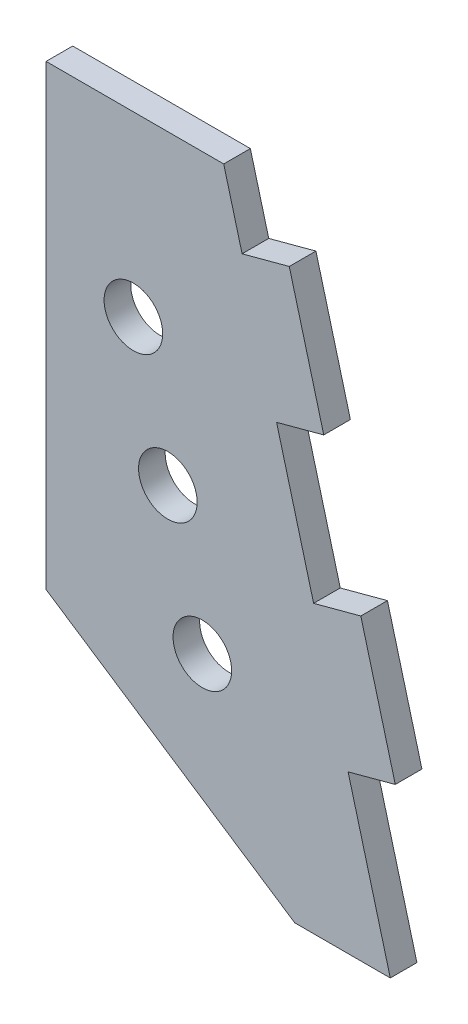
ISO-10303-21;
HEADER;
FILE_DESCRIPTION(('STEP AP214'),'2;1');
FILE_NAME('part.step','',(''),(''),'','','');
FILE_SCHEMA(('AUTOMOTIVE_DESIGN { 1 0 10303 214 1 1 1 1 }'));
ENDSEC;
DATA;
#1=APPLICATION_CONTEXT('core data for automotive mechanical design processes');
#2=APPLICATION_PROTOCOL_DEFINITION('international standard','automotive_design',2000,#1);
#3=PRODUCT_CONTEXT('',#1,'mechanical');
#4=PRODUCT('Part','Part','',(#3));
#5=PRODUCT_RELATED_PRODUCT_CATEGORY('part','',(#4));
#6=PRODUCT_DEFINITION_FORMATION('','',#4);
#7=PRODUCT_DEFINITION_CONTEXT('part definition',#1,'design');
#8=PRODUCT_DEFINITION('design','',#6,#7);
#9=PRODUCT_DEFINITION_SHAPE('','',#8);
#10=(LENGTH_UNIT() NAMED_UNIT(*) SI_UNIT(.MILLI.,.METRE.));
#11=(NAMED_UNIT(*) PLANE_ANGLE_UNIT() SI_UNIT($,.RADIAN.));
#12=(NAMED_UNIT(*) SI_UNIT($,.STERADIAN.) SOLID_ANGLE_UNIT());
#13=UNCERTAINTY_MEASURE_WITH_UNIT(LENGTH_MEASURE(1.E-05),#10,'distance_accuracy_value','');
#14=(GEOMETRIC_REPRESENTATION_CONTEXT(3) GLOBAL_UNCERTAINTY_ASSIGNED_CONTEXT((#13)) GLOBAL_UNIT_ASSIGNED_CONTEXT((#10,
#11,#12)) REPRESENTATION_CONTEXT('',''));
#15=CARTESIAN_POINT('',(0.,0.,0.));
#16=DIRECTION('',(0.,0.,1.));
#17=DIRECTION('',(1.,0.,0.));
#18=AXIS2_PLACEMENT_3D('',#15,#16,#17);
#19=CARTESIAN_POINT('',(0.,0.,0.));
#20=DIRECTION('',(0.,0.,-1.));
#21=DIRECTION('',(-1.,0.,0.));
#22=AXIS2_PLACEMENT_3D('',#19,#20,#21);
#23=PLANE('',#22);
#24=CARTESIAN_POINT('',(9.82984114247129,40.,0.));
#25=DIRECTION('',(0.,0.,1.));
#26=DIRECTION('',(1.,0.,0.));
#27=AXIS2_PLACEMENT_3D('',#24,#25,#26);
#28=CIRCLE('',#27,3.3);
#29=CARTESIAN_POINT('',(13.1298411424713,40.,0.));
#30=VERTEX_POINT('',#29);
#31=EDGE_CURVE('E270',#30,#30,#28,.T.);
#32=ORIENTED_EDGE('',*,*,#31,.T.);
#33=EDGE_LOOP('',(#32));
#34=FACE_BOUND('',#33,.T.);
#35=CARTESIAN_POINT('',(17.594412495547,11.022225211328,0.));
#36=DIRECTION('',(0.,0.,1.));
#37=DIRECTION('',(1.,0.,0.));
#38=AXIS2_PLACEMENT_3D('',#35,#36,#37);
#39=CIRCLE('',#38,3.3);
#40=CARTESIAN_POINT('',(20.894412495547,11.022225211328,0.));
#41=VERTEX_POINT('',#40);
#42=EDGE_CURVE('E203',#41,#41,#39,.T.);
#43=ORIENTED_EDGE('',*,*,#42,.T.);
#44=EDGE_LOOP('',(#43));
#45=FACE_BOUND('',#44,.T.);
#46=CARTESIAN_POINT('',(13.7121268190092,25.511112605664,0.));
#47=DIRECTION('',(0.,0.,1.));
#48=DIRECTION('',(1.,0.,0.));
#49=AXIS2_PLACEMENT_3D('',#46,#47,#48);
#50=CIRCLE('',#49,3.3);
#51=CARTESIAN_POINT('',(17.0121268190092,25.511112605664,0.));
#52=VERTEX_POINT('',#51);
#53=EDGE_CURVE('E221',#52,#52,#50,.T.);
#54=ORIENTED_EDGE('',*,*,#53,.T.);
#55=EDGE_LOOP('',(#54));
#56=FACE_BOUND('',#55,.T.);
#57=DIRECTION('',(1.,0.,0.));
#58=VECTOR('',#57,1.);
#59=CARTESIAN_POINT('',(0.,-10.,0.));
#60=LINE('',#59,#58);
#61=CARTESIAN_POINT('',(28.,-10.,0.));
#62=VERTEX_POINT('',#61);
#63=CARTESIAN_POINT('',(38.7564434701789,-10.,0.));
#64=VERTEX_POINT('',#63);
#65=EDGE_CURVE('E158',#62,#64,#60,.T.);
#66=ORIENTED_EDGE('',*,*,#65,.F.);
#67=DIRECTION('',(0.834335320661301,-0.551257265436931,0.));
#68=VECTOR('',#67,1.);
#69=CARTESIAN_POINT('',(3.90943396226415,5.91698113207547,0.));
#70=LINE('',#69,#68);
#71=CARTESIAN_POINT('',(0.,8.5,0.));
#72=VERTEX_POINT('',#71);
#73=EDGE_CURVE('E62',#72,#62,#70,.T.);
#74=ORIENTED_EDGE('',*,*,#73,.F.);
#75=DIRECTION('',(0.,-1.,0.));
#76=VECTOR('',#75,1.);
#77=CARTESIAN_POINT('',(0.,0.,0.));
#78=LINE('',#77,#76);
#79=CARTESIAN_POINT('',(0.,60.,0.));
#80=VERTEX_POINT('',#79);
#81=EDGE_CURVE('E156',#80,#72,#78,.T.);
#82=ORIENTED_EDGE('',*,*,#81,.F.);
#83=DIRECTION('',(-1.,0.,0.));
#84=VECTOR('',#83,1.);
#85=CARTESIAN_POINT('',(0.,60.,0.));
#86=LINE('',#85,#84);
#87=CARTESIAN_POINT('',(20.,60.,0.));
#88=VERTEX_POINT('',#87);
#89=EDGE_CURVE('E166',#88,#80,#86,.T.);
#90=ORIENTED_EDGE('',*,*,#89,.F.);
#91=DIRECTION('',(-0.258819045102525,0.965925826289067,0.));
#92=VECTOR('',#91,1.);
#93=CARTESIAN_POINT('',(20.,60.,0.));
#94=LINE('',#93,#92);
#95=CARTESIAN_POINT('',(22.0705523608202,52.2725933896875,0.));
#96=VERTEX_POINT('',#95);
#97=EDGE_CURVE('E195',#96,#88,#94,.T.);
#98=ORIENTED_EDGE('',*,*,#97,.F.);
#99=DIRECTION('',(-0.965925826289067,-0.258819045102525,0.));
#100=VECTOR('',#99,1.);
#101=CARTESIAN_POINT('',(22.0705523608202,52.2725933896875,0.));
#102=LINE('',#101,#100);
#103=CARTESIAN_POINT('',(27.3831444054101,53.6960981377513,0.));
#104=VERTEX_POINT('',#103);
#105=EDGE_CURVE('E256',#104,#96,#102,.T.);
#106=ORIENTED_EDGE('',*,*,#105,.F.);
#107=DIRECTION('',(-0.258819045102525,0.965925826289067,0.));
#108=VECTOR('',#107,1.);
#109=CARTESIAN_POINT('',(27.3831444054101,53.6960981377513,0.));
#110=LINE('',#109,#108);
#111=CARTESIAN_POINT('',(31.265430081948,39.2072107434153,0.));
#112=VERTEX_POINT('',#111);
#113=EDGE_CURVE('E262',#112,#104,#110,.T.);
#114=ORIENTED_EDGE('',*,*,#113,.F.);
#115=DIRECTION('',(0.965925826289067,0.258819045102525,0.));
#116=VECTOR('',#115,1.);
#117=CARTESIAN_POINT('',(31.265430081948,39.2072107434153,0.));
#118=LINE('',#117,#116);
#119=CARTESIAN_POINT('',(25.9528380373581,37.7837059953515,0.));
#120=VERTEX_POINT('',#119);
#121=EDGE_CURVE('E342',#120,#112,#118,.T.);
#122=ORIENTED_EDGE('',*,*,#121,.F.);
#123=CARTESIAN_POINT('',(30.1241135085096,22.2162940046486,0.));
#124=VERTEX_POINT('',#123);
#125=EDGE_CURVE('E194',#124,#120,#94,.T.);
#126=ORIENTED_EDGE('',*,*,#125,.F.);
#127=DIRECTION('',(-0.965925826289067,-0.258819045102524,0.));
#128=VECTOR('',#127,1.);
#129=CARTESIAN_POINT('',(30.1241135085096,22.2162940046486,0.));
#130=LINE('',#129,#128);
#131=CARTESIAN_POINT('',(35.4367055530994,23.6397987527124,0.));
#132=VERTEX_POINT('',#131);
#133=EDGE_CURVE('E350',#132,#124,#130,.T.);
#134=ORIENTED_EDGE('',*,*,#133,.F.);
#135=DIRECTION('',(-0.258819045102524,0.965925826289067,0.));
#136=VECTOR('',#135,1.);
#137=CARTESIAN_POINT('',(35.4367055530994,23.6397987527124,0.));
#138=LINE('',#137,#136);
#139=CARTESIAN_POINT('',(39.3189912296373,9.15091135837642,0.));
#140=VERTEX_POINT('',#139);
#141=EDGE_CURVE('E368',#140,#132,#138,.T.);
#142=ORIENTED_EDGE('',*,*,#141,.F.);
#143=DIRECTION('',(0.965925826289067,0.258819045102525,0.));
#144=VECTOR('',#143,1.);
#145=CARTESIAN_POINT('',(39.3189912296373,9.15091135837642,0.));
#146=LINE('',#145,#144);
#147=CARTESIAN_POINT('',(34.0063991850474,7.72740661031254,0.));
#148=VERTEX_POINT('',#147);
#149=EDGE_CURVE('E358',#148,#140,#146,.T.);
#150=ORIENTED_EDGE('',*,*,#149,.F.);
#151=EDGE_CURVE('E176',#64,#148,#94,.T.);
#152=ORIENTED_EDGE('',*,*,#151,.F.);
#153=EDGE_LOOP('',(#66,#74,#82,#90,#98,#106,#114,#122,#126,#134,#142,#150,#152));
#154=FACE_BOUND('',#153,.T.);
#155=ADVANCED_FACE('F46',(#34,#45,#56,#154),#23,.T.);
#156=CARTESIAN_POINT('',(0.,0.,3.));
#157=DIRECTION('',(1.,0.,0.));
#158=DIRECTION('',(0.,0.,-1.));
#159=AXIS2_PLACEMENT_3D('',#156,#157,#158);
#160=PLANE('',#159);
#161=DIRECTION('',(0.,0.,1.));
#162=VECTOR('',#161,1.);
#163=CARTESIAN_POINT('',(0.,8.5,0.));
#164=LINE('',#163,#162);
#165=CARTESIAN_POINT('',(0.,8.5,3.));
#166=VERTEX_POINT('',#165);
#167=EDGE_CURVE('E141',#72,#166,#164,.T.);
#168=ORIENTED_EDGE('',*,*,#167,.T.);
#169=DIRECTION('',(0.,-1.,0.));
#170=VECTOR('',#169,1.);
#171=CARTESIAN_POINT('',(0.,0.,3.));
#172=LINE('',#171,#170);
#173=CARTESIAN_POINT('',(0.,60.,3.));
#174=VERTEX_POINT('',#173);
#175=EDGE_CURVE('E180',#174,#166,#172,.T.);
#176=ORIENTED_EDGE('',*,*,#175,.F.);
#177=DIRECTION('',(0.,0.,-1.));
#178=VECTOR('',#177,1.);
#179=CARTESIAN_POINT('',(0.,60.,3.));
#180=LINE('',#179,#178);
#181=EDGE_CURVE('E55',#174,#80,#180,.T.);
#182=ORIENTED_EDGE('',*,*,#181,.T.);
#183=ORIENTED_EDGE('',*,*,#81,.T.);
#184=EDGE_LOOP('',(#168,#176,#182,#183));
#185=FACE_BOUND('',#184,.T.);
#186=ADVANCED_FACE('F162',(#185),#160,.F.);
#187=CARTESIAN_POINT('',(0.,0.,3.));
#188=DIRECTION('',(0.,0.,-1.));
#189=DIRECTION('',(-1.,0.,0.));
#190=AXIS2_PLACEMENT_3D('',#187,#188,#189);
#191=PLANE('',#190);
#192=CARTESIAN_POINT('',(17.594412495547,11.022225211328,3.));
#193=DIRECTION('',(0.,0.,1.));
#194=DIRECTION('',(1.,0.,0.));
#195=AXIS2_PLACEMENT_3D('',#192,#193,#194);
#196=CIRCLE('',#195,3.29999999999999);
#197=CARTESIAN_POINT('',(20.894412495547,11.022225211328,3.));
#198=VERTEX_POINT('',#197);
#199=EDGE_CURVE('E213',#198,#198,#196,.T.);
#200=ORIENTED_EDGE('',*,*,#199,.F.);
#201=EDGE_LOOP('',(#200));
#202=FACE_BOUND('',#201,.T.);
#203=CARTESIAN_POINT('',(13.7121268190092,25.511112605664,3.));
#204=DIRECTION('',(0.,0.,1.));
#205=DIRECTION('',(1.,0.,0.));
#206=AXIS2_PLACEMENT_3D('',#203,#204,#205);
#207=CIRCLE('',#206,3.29999999999999);
#208=CARTESIAN_POINT('',(17.0121268190092,25.511112605664,3.));
#209=VERTEX_POINT('',#208);
#210=EDGE_CURVE('E274',#209,#209,#207,.T.);
#211=ORIENTED_EDGE('',*,*,#210,.F.);
#212=EDGE_LOOP('',(#211));
#213=FACE_BOUND('',#212,.T.);
#214=CARTESIAN_POINT('',(9.82984114247129,40.,3.));
#215=DIRECTION('',(0.,0.,1.));
#216=DIRECTION('',(1.,0.,0.));
#217=AXIS2_PLACEMENT_3D('',#214,#215,#216);
#218=CIRCLE('',#217,3.29999999999999);
#219=CARTESIAN_POINT('',(13.1298411424713,40.,3.));
#220=VERTEX_POINT('',#219);
#221=EDGE_CURVE('E266',#220,#220,#218,.T.);
#222=ORIENTED_EDGE('',*,*,#221,.F.);
#223=EDGE_LOOP('',(#222));
#224=FACE_BOUND('',#223,.T.);
#225=DIRECTION('',(0.834335320661301,-0.551257265436931,0.));
#226=VECTOR('',#225,1.);
#227=CARTESIAN_POINT('',(3.90943396226415,5.91698113207547,3.));
#228=LINE('',#227,#226);
#229=CARTESIAN_POINT('',(28.,-10.,3.));
#230=VERTEX_POINT('',#229);
#231=EDGE_CURVE('E144',#166,#230,#228,.T.);
#232=ORIENTED_EDGE('',*,*,#231,.T.);
#233=DIRECTION('',(1.,0.,0.));
#234=VECTOR('',#233,1.);
#235=CARTESIAN_POINT('',(0.,-10.,3.));
#236=LINE('',#235,#234);
#237=CARTESIAN_POINT('',(38.7564434701789,-10.,3.));
#238=VERTEX_POINT('',#237);
#239=EDGE_CURVE('E377',#230,#238,#236,.T.);
#240=ORIENTED_EDGE('',*,*,#239,.T.);
#241=DIRECTION('',(-0.258819045102525,0.965925826289067,0.));
#242=VECTOR('',#241,1.);
#243=CARTESIAN_POINT('',(20.,60.,3.));
#244=LINE('',#243,#242);
#245=CARTESIAN_POINT('',(34.0063991850474,7.72740661031254,3.));
#246=VERTEX_POINT('',#245);
#247=EDGE_CURVE('E174',#238,#246,#244,.T.);
#248=ORIENTED_EDGE('',*,*,#247,.T.);
#249=DIRECTION('',(0.965925826289067,0.258819045102525,0.));
#250=VECTOR('',#249,1.);
#251=CARTESIAN_POINT('',(39.3189912296373,9.15091135837642,3.));
#252=LINE('',#251,#250);
#253=CARTESIAN_POINT('',(39.3189912296373,9.15091135837642,3.));
#254=VERTEX_POINT('',#253);
#255=EDGE_CURVE('E362',#246,#254,#252,.T.);
#256=ORIENTED_EDGE('',*,*,#255,.T.);
#257=DIRECTION('',(-0.258819045102524,0.965925826289067,0.));
#258=VECTOR('',#257,1.);
#259=CARTESIAN_POINT('',(35.4367055530994,23.6397987527124,3.));
#260=LINE('',#259,#258);
#261=CARTESIAN_POINT('',(35.4367055530994,23.6397987527124,3.));
#262=VERTEX_POINT('',#261);
#263=EDGE_CURVE('E359',#254,#262,#260,.T.);
#264=ORIENTED_EDGE('',*,*,#263,.T.);
#265=DIRECTION('',(-0.965925826289067,-0.258819045102524,0.));
#266=VECTOR('',#265,1.);
#267=CARTESIAN_POINT('',(30.1241135085096,22.2162940046486,3.));
#268=LINE('',#267,#266);
#269=CARTESIAN_POINT('',(30.1241135085096,22.2162940046486,3.));
#270=VERTEX_POINT('',#269);
#271=EDGE_CURVE('E70',#262,#270,#268,.T.);
#272=ORIENTED_EDGE('',*,*,#271,.T.);
#273=CARTESIAN_POINT('',(25.9528380373581,37.7837059953514,3.));
#274=VERTEX_POINT('',#273);
#275=EDGE_CURVE('E172',#270,#274,#244,.T.);
#276=ORIENTED_EDGE('',*,*,#275,.T.);
#277=DIRECTION('',(0.965925826289067,0.258819045102525,0.));
#278=VECTOR('',#277,1.);
#279=CARTESIAN_POINT('',(31.265430081948,39.2072107434153,3.));
#280=LINE('',#279,#278);
#281=CARTESIAN_POINT('',(31.265430081948,39.2072107434153,3.));
#282=VERTEX_POINT('',#281);
#283=EDGE_CURVE('E238',#274,#282,#280,.T.);
#284=ORIENTED_EDGE('',*,*,#283,.T.);
#285=DIRECTION('',(-0.258819045102525,0.965925826289067,0.));
#286=VECTOR('',#285,1.);
#287=CARTESIAN_POINT('',(27.3831444054101,53.6960981377513,3.));
#288=LINE('',#287,#286);
#289=CARTESIAN_POINT('',(27.3831444054101,53.6960981377513,3.));
#290=VERTEX_POINT('',#289);
#291=EDGE_CURVE('E251',#282,#290,#288,.T.);
#292=ORIENTED_EDGE('',*,*,#291,.T.);
#293=DIRECTION('',(-0.965925826289067,-0.258819045102525,0.));
#294=VECTOR('',#293,1.);
#295=CARTESIAN_POINT('',(22.0705523608202,52.2725933896875,3.));
#296=LINE('',#295,#294);
#297=CARTESIAN_POINT('',(22.0705523608202,52.2725933896875,3.));
#298=VERTEX_POINT('',#297);
#299=EDGE_CURVE('E340',#290,#298,#296,.T.);
#300=ORIENTED_EDGE('',*,*,#299,.T.);
#301=CARTESIAN_POINT('',(20.,60.,3.));
#302=VERTEX_POINT('',#301);
#303=EDGE_CURVE('E165',#298,#302,#244,.T.);
#304=ORIENTED_EDGE('',*,*,#303,.T.);
#305=DIRECTION('',(-1.,0.,0.));
#306=VECTOR('',#305,1.);
#307=CARTESIAN_POINT('',(0.,60.,3.));
#308=LINE('',#307,#306);
#309=EDGE_CURVE('E185',#302,#174,#308,.T.);
#310=ORIENTED_EDGE('',*,*,#309,.T.);
#311=ORIENTED_EDGE('',*,*,#175,.T.);
#312=EDGE_LOOP('',(#232,#240,#248,#256,#264,#272,#276,#284,#292,#300,#304,#310,#311));
#313=FACE_BOUND('',#312,.T.);
#314=ADVANCED_FACE('F236',(#202,#213,#224,#313),#191,.F.);
#315=CARTESIAN_POINT('',(0.,-10.,0.));
#316=DIRECTION('',(0.,-1.,0.));
#317=DIRECTION('',(0.,0.,-1.));
#318=AXIS2_PLACEMENT_3D('',#315,#316,#317);
#319=PLANE('',#318);
#320=ORIENTED_EDGE('',*,*,#239,.F.);
#321=DIRECTION('',(0.,0.,1.));
#322=VECTOR('',#321,1.);
#323=CARTESIAN_POINT('',(28.,-10.,0.));
#324=LINE('',#323,#322);
#325=EDGE_CURVE('E150',#62,#230,#324,.T.);
#326=ORIENTED_EDGE('',*,*,#325,.F.);
#327=ORIENTED_EDGE('',*,*,#65,.T.);
#328=DIRECTION('',(0.,0.,1.));
#329=VECTOR('',#328,1.);
#330=CARTESIAN_POINT('',(38.7564434701789,-10.,0.));
#331=LINE('',#330,#329);
#332=EDGE_CURVE('E365',#64,#238,#331,.T.);
#333=ORIENTED_EDGE('',*,*,#332,.T.);
#334=EDGE_LOOP('',(#320,#326,#327,#333));
#335=FACE_BOUND('',#334,.T.);
#336=ADVANCED_FACE('F294',(#335),#319,.T.);
#337=CARTESIAN_POINT('',(20.,60.,3.));
#338=DIRECTION('',(-0.965925826289067,-0.258819045102525,0.));
#339=DIRECTION('',(0.258819045102525,-0.965925826289067,0.));
#340=AXIS2_PLACEMENT_3D('',#337,#338,#339);
#341=PLANE('',#340);
#342=ORIENTED_EDGE('',*,*,#275,.F.);
#343=DIRECTION('',(0.,0.,1.));
#344=VECTOR('',#343,1.);
#345=CARTESIAN_POINT('',(30.1241135085096,22.2162940046486,0.));
#346=LINE('',#345,#344);
#347=EDGE_CURVE('E252',#124,#270,#346,.T.);
#348=ORIENTED_EDGE('',*,*,#347,.F.);
#349=ORIENTED_EDGE('',*,*,#125,.T.);
#350=DIRECTION('',(0.,0.,1.));
#351=VECTOR('',#350,1.);
#352=CARTESIAN_POINT('',(25.9528380373581,37.7837059953515,0.));
#353=LINE('',#352,#351);
#354=EDGE_CURVE('E246',#120,#274,#353,.T.);
#355=ORIENTED_EDGE('',*,*,#354,.T.);
#356=EDGE_LOOP('',(#342,#348,#349,#355));
#357=FACE_BOUND('',#356,.T.);
#358=ADVANCED_FACE('F254',(#357),#341,.F.);
#359=DIRECTION('',(0.,0.,1.));
#360=VECTOR('',#359,1.);
#361=CARTESIAN_POINT('',(22.0705523608202,52.2725933896875,0.));
#362=LINE('',#361,#360);
#363=EDGE_CURVE('E271',#96,#298,#362,.T.);
#364=ORIENTED_EDGE('',*,*,#363,.F.);
#365=ORIENTED_EDGE('',*,*,#97,.T.);
#366=DIRECTION('',(0.,0.,-1.));
#367=VECTOR('',#366,1.);
#368=CARTESIAN_POINT('',(20.,60.,3.));
#369=LINE('',#368,#367);
#370=EDGE_CURVE('E11',#302,#88,#369,.T.);
#371=ORIENTED_EDGE('',*,*,#370,.F.);
#372=ORIENTED_EDGE('',*,*,#303,.F.);
#373=EDGE_LOOP('',(#364,#365,#371,#372));
#374=FACE_BOUND('',#373,.T.);
#375=ADVANCED_FACE('F327',(#374),#341,.F.);
#376=ORIENTED_EDGE('',*,*,#151,.T.);
#377=DIRECTION('',(0.,0.,1.));
#378=VECTOR('',#377,1.);
#379=CARTESIAN_POINT('',(34.0063991850474,7.72740661031254,0.));
#380=LINE('',#379,#378);
#381=EDGE_CURVE('E346',#148,#246,#380,.T.);
#382=ORIENTED_EDGE('',*,*,#381,.T.);
#383=ORIENTED_EDGE('',*,*,#247,.F.);
#384=ORIENTED_EDGE('',*,*,#332,.F.);
#385=EDGE_LOOP('',(#376,#382,#383,#384));
#386=FACE_BOUND('',#385,.T.);
#387=ADVANCED_FACE('F48',(#386),#341,.F.);
#388=CARTESIAN_POINT('',(0.,60.,3.));
#389=DIRECTION('',(0.,-1.,0.));
#390=DIRECTION('',(0.,0.,-1.));
#391=AXIS2_PLACEMENT_3D('',#388,#389,#390);
#392=PLANE('',#391);
#393=ORIENTED_EDGE('',*,*,#89,.T.);
#394=ORIENTED_EDGE('',*,*,#181,.F.);
#395=ORIENTED_EDGE('',*,*,#309,.F.);
#396=ORIENTED_EDGE('',*,*,#370,.T.);
#397=EDGE_LOOP('',(#393,#394,#395,#396));
#398=FACE_BOUND('',#397,.T.);
#399=ADVANCED_FACE('F319',(#398),#392,.F.);
#400=CARTESIAN_POINT('',(17.594412495547,11.022225211328,3.));
#401=DIRECTION('',(0.,0.,1.));
#402=DIRECTION('',(1.,0.,0.));
#403=AXIS2_PLACEMENT_3D('',#400,#401,#402);
#404=CYLINDRICAL_SURFACE('',#403,3.29999999999999);
#405=ORIENTED_EDGE('',*,*,#42,.F.);
#406=EDGE_LOOP('',(#405));
#407=FACE_BOUND('',#406,.T.);
#408=ORIENTED_EDGE('',*,*,#199,.T.);
#409=EDGE_LOOP('',(#408));
#410=FACE_BOUND('',#409,.T.);
#411=ADVANCED_FACE('F288',(#407,#410),#404,.F.);
#412=CARTESIAN_POINT('',(13.7121268190092,25.511112605664,3.));
#413=DIRECTION('',(0.,0.,1.));
#414=DIRECTION('',(1.,0.,0.));
#415=AXIS2_PLACEMENT_3D('',#412,#413,#414);
#416=CYLINDRICAL_SURFACE('',#415,3.29999999999999);
#417=ORIENTED_EDGE('',*,*,#53,.F.);
#418=EDGE_LOOP('',(#417));
#419=FACE_BOUND('',#418,.T.);
#420=ORIENTED_EDGE('',*,*,#210,.T.);
#421=EDGE_LOOP('',(#420));
#422=FACE_BOUND('',#421,.T.);
#423=ADVANCED_FACE('F284',(#419,#422),#416,.F.);
#424=CARTESIAN_POINT('',(9.82984114247129,40.,3.));
#425=DIRECTION('',(0.,0.,1.));
#426=DIRECTION('',(1.,0.,0.));
#427=AXIS2_PLACEMENT_3D('',#424,#425,#426);
#428=CYLINDRICAL_SURFACE('',#427,3.29999999999999);
#429=ORIENTED_EDGE('',*,*,#31,.F.);
#430=EDGE_LOOP('',(#429));
#431=FACE_BOUND('',#430,.T.);
#432=ORIENTED_EDGE('',*,*,#221,.T.);
#433=EDGE_LOOP('',(#432));
#434=FACE_BOUND('',#433,.T.);
#435=ADVANCED_FACE('F287',(#431,#434),#428,.F.);
#436=CARTESIAN_POINT('',(22.0705523608202,52.2725933896875,0.));
#437=DIRECTION('',(-0.258819045102525,0.965925826289067,0.));
#438=DIRECTION('',(-0.965925826289067,-0.258819045102525,0.));
#439=AXIS2_PLACEMENT_3D('',#436,#437,#438);
#440=PLANE('',#439);
#441=ORIENTED_EDGE('',*,*,#299,.F.);
#442=DIRECTION('',(0.,0.,1.));
#443=VECTOR('',#442,1.);
#444=CARTESIAN_POINT('',(27.3831444054101,53.6960981377513,0.));
#445=LINE('',#444,#443);
#446=EDGE_CURVE('E260',#104,#290,#445,.T.);
#447=ORIENTED_EDGE('',*,*,#446,.F.);
#448=ORIENTED_EDGE('',*,*,#105,.T.);
#449=ORIENTED_EDGE('',*,*,#363,.T.);
#450=EDGE_LOOP('',(#441,#447,#448,#449));
#451=FACE_BOUND('',#450,.T.);
#452=ADVANCED_FACE('F300',(#451),#440,.T.);
#453=CARTESIAN_POINT('',(27.3831444054101,53.6960981377513,0.));
#454=DIRECTION('',(0.965925826289067,0.258819045102525,0.));
#455=DIRECTION('',(-0.258819045102525,0.965925826289067,0.));
#456=AXIS2_PLACEMENT_3D('',#453,#454,#455);
#457=PLANE('',#456);
#458=ORIENTED_EDGE('',*,*,#291,.F.);
#459=DIRECTION('',(0.,0.,1.));
#460=VECTOR('',#459,1.);
#461=CARTESIAN_POINT('',(31.265430081948,39.2072107434153,0.));
#462=LINE('',#461,#460);
#463=EDGE_CURVE('E248',#112,#282,#462,.T.);
#464=ORIENTED_EDGE('',*,*,#463,.F.);
#465=ORIENTED_EDGE('',*,*,#113,.T.);
#466=ORIENTED_EDGE('',*,*,#446,.T.);
#467=EDGE_LOOP('',(#458,#464,#465,#466));
#468=FACE_BOUND('',#467,.T.);
#469=ADVANCED_FACE('F306',(#468),#457,.T.);
#470=CARTESIAN_POINT('',(31.265430081948,39.2072107434153,0.));
#471=DIRECTION('',(0.258819045102525,-0.965925826289067,0.));
#472=DIRECTION('',(0.965925826289067,0.258819045102525,0.));
#473=AXIS2_PLACEMENT_3D('',#470,#471,#472);
#474=PLANE('',#473);
#475=ORIENTED_EDGE('',*,*,#283,.F.);
#476=ORIENTED_EDGE('',*,*,#354,.F.);
#477=ORIENTED_EDGE('',*,*,#121,.T.);
#478=ORIENTED_EDGE('',*,*,#463,.T.);
#479=EDGE_LOOP('',(#475,#476,#477,#478));
#480=FACE_BOUND('',#479,.T.);
#481=ADVANCED_FACE('F244',(#480),#474,.T.);
#482=CARTESIAN_POINT('',(30.1241135085096,22.2162940046486,0.));
#483=DIRECTION('',(-0.258819045102524,0.965925826289067,0.));
#484=DIRECTION('',(-0.965925826289068,-0.258819045102524,0.));
#485=AXIS2_PLACEMENT_3D('',#482,#483,#484);
#486=PLANE('',#485);
#487=ORIENTED_EDGE('',*,*,#271,.F.);
#488=DIRECTION('',(0.,0.,1.));
#489=VECTOR('',#488,1.);
#490=CARTESIAN_POINT('',(35.4367055530994,23.6397987527124,0.));
#491=LINE('',#490,#489);
#492=EDGE_CURVE('E353',#132,#262,#491,.T.);
#493=ORIENTED_EDGE('',*,*,#492,.F.);
#494=ORIENTED_EDGE('',*,*,#133,.T.);
#495=ORIENTED_EDGE('',*,*,#347,.T.);
#496=EDGE_LOOP('',(#487,#493,#494,#495));
#497=FACE_BOUND('',#496,.T.);
#498=ADVANCED_FACE('F394',(#497),#486,.T.);
#499=CARTESIAN_POINT('',(35.4367055530994,23.6397987527124,0.));
#500=DIRECTION('',(0.965925826289067,0.258819045102524,0.));
#501=DIRECTION('',(-0.258819045102524,0.965925826289067,0.));
#502=AXIS2_PLACEMENT_3D('',#499,#500,#501);
#503=PLANE('',#502);
#504=ORIENTED_EDGE('',*,*,#263,.F.);
#505=DIRECTION('',(0.,0.,1.));
#506=VECTOR('',#505,1.);
#507=CARTESIAN_POINT('',(39.3189912296373,9.15091135837642,0.));
#508=LINE('',#507,#506);
#509=EDGE_CURVE('E349',#140,#254,#508,.T.);
#510=ORIENTED_EDGE('',*,*,#509,.F.);
#511=ORIENTED_EDGE('',*,*,#141,.T.);
#512=ORIENTED_EDGE('',*,*,#492,.T.);
#513=EDGE_LOOP('',(#504,#510,#511,#512));
#514=FACE_BOUND('',#513,.T.);
#515=ADVANCED_FACE('F392',(#514),#503,.T.);
#516=CARTESIAN_POINT('',(39.3189912296373,9.15091135837642,0.));
#517=DIRECTION('',(0.258819045102525,-0.965925826289067,0.));
#518=DIRECTION('',(0.965925826289067,0.258819045102525,0.));
#519=AXIS2_PLACEMENT_3D('',#516,#517,#518);
#520=PLANE('',#519);
#521=ORIENTED_EDGE('',*,*,#255,.F.);
#522=ORIENTED_EDGE('',*,*,#381,.F.);
#523=ORIENTED_EDGE('',*,*,#149,.T.);
#524=ORIENTED_EDGE('',*,*,#509,.T.);
#525=EDGE_LOOP('',(#521,#522,#523,#524));
#526=FACE_BOUND('',#525,.T.);
#527=ADVANCED_FACE('F387',(#526),#520,.T.);
#528=CARTESIAN_POINT('',(3.90943396226415,5.91698113207547,0.));
#529=DIRECTION('',(-0.551257265436931,-0.834335320661301,0.));
#530=DIRECTION('',(0.834335320661301,-0.551257265436931,0.));
#531=AXIS2_PLACEMENT_3D('',#528,#529,#530);
#532=PLANE('',#531);
#533=ORIENTED_EDGE('',*,*,#231,.F.);
#534=ORIENTED_EDGE('',*,*,#167,.F.);
#535=ORIENTED_EDGE('',*,*,#73,.T.);
#536=ORIENTED_EDGE('',*,*,#325,.T.);
#537=EDGE_LOOP('',(#533,#534,#535,#536));
#538=FACE_BOUND('',#537,.T.);
#539=ADVANCED_FACE('F142',(#538),#532,.T.);
#540=CLOSED_SHELL('',(#155,#186,#314,#336,#358,#375,#387,#399,#411,#423,#435,#452,#469,#481,
#498,#515,#527,#539));
#541=MANIFOLD_SOLID_BREP('B2',#540);
#542=ADVANCED_BREP_SHAPE_REPRESENTATION('',(#18,#541),#14);
#543=SHAPE_DEFINITION_REPRESENTATION(#9,#542);
ENDSEC;
END-ISO-10303-21;
